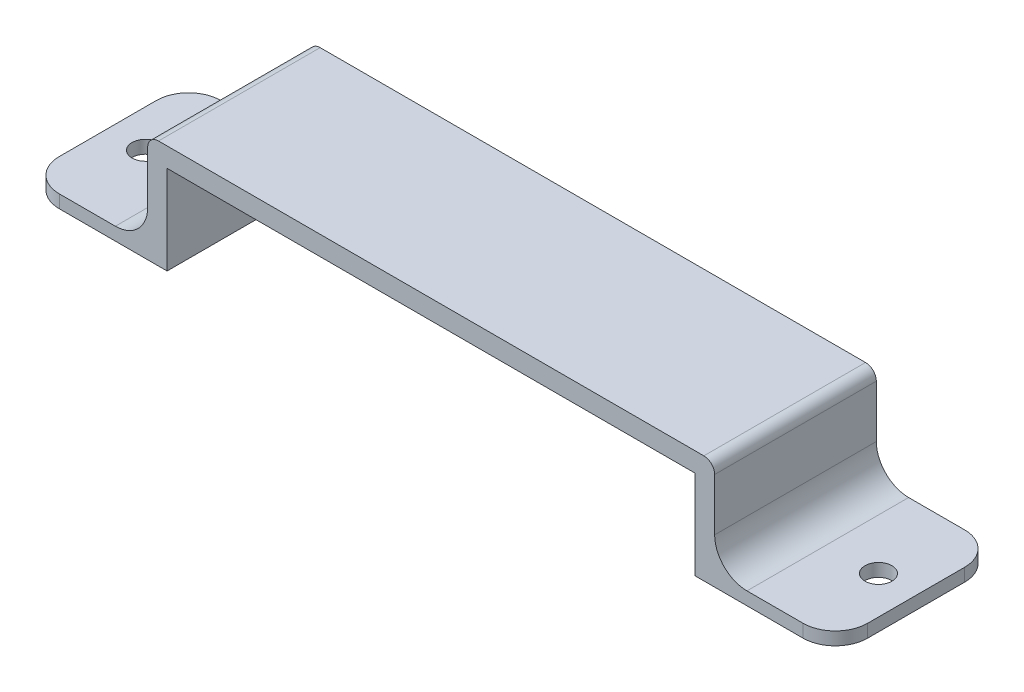
ISO-10303-21;
HEADER;
FILE_DESCRIPTION(('STEP AP214'),'2;1');
FILE_NAME('part.step','',(''),(''),'','','');
FILE_SCHEMA(('AUTOMOTIVE_DESIGN { 1 0 10303 214 1 1 1 1 }'));
ENDSEC;
DATA;
#1=APPLICATION_CONTEXT('core data for automotive mechanical design processes');
#2=APPLICATION_PROTOCOL_DEFINITION('international standard','automotive_design',2000,#1);
#3=PRODUCT_CONTEXT('',#1,'mechanical');
#4=PRODUCT('Part','Part','',(#3));
#5=PRODUCT_RELATED_PRODUCT_CATEGORY('part','',(#4));
#6=PRODUCT_DEFINITION_FORMATION('','',#4);
#7=PRODUCT_DEFINITION_CONTEXT('part definition',#1,'design');
#8=PRODUCT_DEFINITION('design','',#6,#7);
#9=PRODUCT_DEFINITION_SHAPE('','',#8);
#10=(LENGTH_UNIT() NAMED_UNIT(*) SI_UNIT(.MILLI.,.METRE.));
#11=(NAMED_UNIT(*) PLANE_ANGLE_UNIT() SI_UNIT($,.RADIAN.));
#12=(NAMED_UNIT(*) SI_UNIT($,.STERADIAN.) SOLID_ANGLE_UNIT());
#13=UNCERTAINTY_MEASURE_WITH_UNIT(LENGTH_MEASURE(1.E-05),#10,'distance_accuracy_value','');
#14=(GEOMETRIC_REPRESENTATION_CONTEXT(3) GLOBAL_UNCERTAINTY_ASSIGNED_CONTEXT((#13)) GLOBAL_UNIT_ASSIGNED_CONTEXT((#10,
#11,#12)) REPRESENTATION_CONTEXT('',''));
#15=CARTESIAN_POINT('',(0.,0.,0.));
#16=DIRECTION('',(0.,0.,1.));
#17=DIRECTION('',(1.,0.,0.));
#18=AXIS2_PLACEMENT_3D('',#15,#16,#17);
#19=CARTESIAN_POINT('',(-21.8742298573392,1.2,15.));
#20=DIRECTION('',(1.,0.,0.));
#21=DIRECTION('',(0.,1.,0.));
#22=AXIS2_PLACEMENT_3D('',#19,#20,#21);
#23=PLANE('',#22);
#24=DIRECTION('',(0.,0.,-1.));
#25=VECTOR('',#24,1.);
#26=CARTESIAN_POINT('',(-21.8742298573392,0.,15.));
#27=LINE('',#26,#25);
#28=CARTESIAN_POINT('',(-21.8742298573392,0.,12.));
#29=VERTEX_POINT('',#28);
#30=CARTESIAN_POINT('',(-21.8742298573392,0.,3.));
#31=VERTEX_POINT('',#30);
#32=EDGE_CURVE('E200',#29,#31,#27,.T.);
#33=ORIENTED_EDGE('',*,*,#32,.F.);
#34=DIRECTION('',(0.,-1.,0.));
#35=VECTOR('',#34,1.);
#36=CARTESIAN_POINT('',(-21.8742298573392,1.2,12.));
#37=LINE('',#36,#35);
#38=CARTESIAN_POINT('',(-21.8742298573392,1.2,12.));
#39=VERTEX_POINT('',#38);
#40=EDGE_CURVE('E355',#29,#39,#37,.F.);
#41=ORIENTED_EDGE('',*,*,#40,.T.);
#42=DIRECTION('',(0.,0.,-1.));
#43=VECTOR('',#42,1.);
#44=CARTESIAN_POINT('',(-21.8742298573392,1.2,15.));
#45=LINE('',#44,#43);
#46=CARTESIAN_POINT('',(-21.8742298573392,1.2,3.));
#47=VERTEX_POINT('',#46);
#48=EDGE_CURVE('E236',#39,#47,#45,.T.);
#49=ORIENTED_EDGE('',*,*,#48,.T.);
#50=DIRECTION('',(0.,-1.,0.));
#51=VECTOR('',#50,1.);
#52=CARTESIAN_POINT('',(-21.8742298573392,1.2,3.));
#53=LINE('',#52,#51);
#54=EDGE_CURVE('E351',#47,#31,#53,.T.);
#55=ORIENTED_EDGE('',*,*,#54,.T.);
#56=EDGE_LOOP('',(#33,#41,#49,#55));
#57=FACE_BOUND('',#56,.T.);
#58=ADVANCED_FACE('F39',(#57),#23,.F.);
#59=CARTESIAN_POINT('',(-21.8742298573392,0.,15.));
#60=DIRECTION('',(0.,1.,0.));
#61=DIRECTION('',(-1.,0.,0.));
#62=AXIS2_PLACEMENT_3D('',#59,#60,#61);
#63=PLANE('',#62);
#64=CARTESIAN_POINT('',(-18.3742298573392,0.,7.5));
#65=DIRECTION('',(0.,1.,0.));
#66=DIRECTION('',(-1.,0.,0.));
#67=AXIS2_PLACEMENT_3D('',#64,#65,#66);
#68=CIRCLE('',#67,1.25);
#69=CARTESIAN_POINT('',(-19.6242298573392,0.,7.5));
#70=VERTEX_POINT('',#69);
#71=EDGE_CURVE('E240',#70,#70,#68,.F.);
#72=ORIENTED_EDGE('',*,*,#71,.F.);
#73=EDGE_LOOP('',(#72));
#74=FACE_BOUND('',#73,.T.);
#75=DIRECTION('',(1.,0.,0.));
#76=VECTOR('',#75,1.);
#77=CARTESIAN_POINT('',(-21.8742298573392,0.,15.));
#78=LINE('',#77,#76);
#79=CARTESIAN_POINT('',(-18.8742298573392,0.,15.));
#80=VERTEX_POINT('',#79);
#81=CARTESIAN_POINT('',(-8.87422985733918,0.,15.));
#82=VERTEX_POINT('',#81);
#83=EDGE_CURVE('E179',#80,#82,#78,.T.);
#84=ORIENTED_EDGE('',*,*,#83,.F.);
#85=CARTESIAN_POINT('',(-18.8742298573392,0.,12.));
#86=DIRECTION('',(0.,1.,0.));
#87=DIRECTION('',(-1.,0.,0.));
#88=AXIS2_PLACEMENT_3D('',#85,#86,#87);
#89=CIRCLE('',#88,3.);
#90=EDGE_CURVE('E348',#80,#29,#89,.F.);
#91=ORIENTED_EDGE('',*,*,#90,.T.);
#92=ORIENTED_EDGE('',*,*,#32,.T.);
#93=CARTESIAN_POINT('',(-18.8742298573392,0.,3.));
#94=DIRECTION('',(0.,1.,0.));
#95=DIRECTION('',(-1.,0.,0.));
#96=AXIS2_PLACEMENT_3D('',#93,#94,#95);
#97=CIRCLE('',#96,3.);
#98=CARTESIAN_POINT('',(-18.8742298573392,0.,0.));
#99=VERTEX_POINT('',#98);
#100=EDGE_CURVE('E345',#31,#99,#97,.F.);
#101=ORIENTED_EDGE('',*,*,#100,.T.);
#102=DIRECTION('',(1.,0.,0.));
#103=VECTOR('',#102,1.);
#104=CARTESIAN_POINT('',(-21.8742298573392,0.,0.));
#105=LINE('',#104,#103);
#106=CARTESIAN_POINT('',(-8.87422985733918,0.,0.));
#107=VERTEX_POINT('',#106);
#108=EDGE_CURVE('E196',#99,#107,#105,.T.);
#109=ORIENTED_EDGE('',*,*,#108,.T.);
#110=DIRECTION('',(0.,0.,-1.));
#111=VECTOR('',#110,1.);
#112=CARTESIAN_POINT('',(-8.87422985733918,0.,15.));
#113=LINE('',#112,#111);
#114=EDGE_CURVE('E193',#82,#107,#113,.T.);
#115=ORIENTED_EDGE('',*,*,#114,.F.);
#116=EDGE_LOOP('',(#84,#91,#92,#101,#109,#115));
#117=FACE_BOUND('',#116,.T.);
#118=ADVANCED_FACE('F194',(#74,#117),#63,.F.);
#119=CARTESIAN_POINT('',(-8.87422985733918,0.,15.));
#120=DIRECTION('',(-1.,0.,0.));
#121=DIRECTION('',(0.,-1.,0.));
#122=AXIS2_PLACEMENT_3D('',#119,#120,#121);
#123=PLANE('',#122);
#124=DIRECTION('',(0.,1.,0.));
#125=VECTOR('',#124,1.);
#126=CARTESIAN_POINT('',(-8.87422985733918,0.,0.));
#127=LINE('',#126,#125);
#128=CARTESIAN_POINT('',(-8.87422985733918,8.25,0.));
#129=VERTEX_POINT('',#128);
#130=EDGE_CURVE('E239',#107,#129,#127,.T.);
#131=ORIENTED_EDGE('',*,*,#130,.T.);
#132=DIRECTION('',(0.,0.,-1.));
#133=VECTOR('',#132,1.);
#134=CARTESIAN_POINT('',(-8.87422985733918,8.25,15.));
#135=LINE('',#134,#133);
#136=CARTESIAN_POINT('',(-8.87422985733918,8.25,15.));
#137=VERTEX_POINT('',#136);
#138=EDGE_CURVE('E201',#137,#129,#135,.T.);
#139=ORIENTED_EDGE('',*,*,#138,.F.);
#140=DIRECTION('',(0.,1.,0.));
#141=VECTOR('',#140,1.);
#142=CARTESIAN_POINT('',(-8.87422985733918,0.,15.));
#143=LINE('',#142,#141);
#144=EDGE_CURVE('E183',#82,#137,#143,.T.);
#145=ORIENTED_EDGE('',*,*,#144,.F.);
#146=ORIENTED_EDGE('',*,*,#114,.T.);
#147=EDGE_LOOP('',(#131,#139,#145,#146));
#148=FACE_BOUND('',#147,.T.);
#149=ADVANCED_FACE('F203',(#148),#123,.F.);
#150=CARTESIAN_POINT('',(-8.87422985733918,8.25,15.));
#151=DIRECTION('',(0.,1.,0.));
#152=DIRECTION('',(0.,0.,1.));
#153=AXIS2_PLACEMENT_3D('',#150,#151,#152);
#154=PLANE('',#153);
#155=DIRECTION('',(1.,0.,0.));
#156=VECTOR('',#155,1.);
#157=CARTESIAN_POINT('',(-8.87422985733918,8.25,0.));
#158=LINE('',#157,#156);
#159=CARTESIAN_POINT('',(40.1257701426608,8.25,0.));
#160=VERTEX_POINT('',#159);
#161=EDGE_CURVE('E243',#129,#160,#158,.T.);
#162=ORIENTED_EDGE('',*,*,#161,.T.);
#163=DIRECTION('',(0.,0.,-1.));
#164=VECTOR('',#163,1.);
#165=CARTESIAN_POINT('',(40.1257701426608,8.25,15.));
#166=LINE('',#165,#164);
#167=CARTESIAN_POINT('',(40.1257701426608,8.25,15.));
#168=VERTEX_POINT('',#167);
#169=EDGE_CURVE('E284',#168,#160,#166,.T.);
#170=ORIENTED_EDGE('',*,*,#169,.F.);
#171=DIRECTION('',(1.,0.,0.));
#172=VECTOR('',#171,1.);
#173=CARTESIAN_POINT('',(-8.87422985733918,8.25,15.));
#174=LINE('',#173,#172);
#175=EDGE_CURVE('E207',#137,#168,#174,.T.);
#176=ORIENTED_EDGE('',*,*,#175,.F.);
#177=ORIENTED_EDGE('',*,*,#138,.T.);
#178=EDGE_LOOP('',(#162,#170,#176,#177));
#179=FACE_BOUND('',#178,.T.);
#180=ADVANCED_FACE('F444',(#179),#154,.F.);
#181=CARTESIAN_POINT('',(40.1257701426608,8.25,15.));
#182=DIRECTION('',(1.,0.,0.));
#183=DIRECTION('',(0.,1.,0.));
#184=AXIS2_PLACEMENT_3D('',#181,#182,#183);
#185=PLANE('',#184);
#186=DIRECTION('',(0.,-1.,0.));
#187=VECTOR('',#186,1.);
#188=CARTESIAN_POINT('',(40.1257701426608,8.25,0.));
#189=LINE('',#188,#187);
#190=CARTESIAN_POINT('',(40.1257701426608,0.,0.));
#191=VERTEX_POINT('',#190);
#192=EDGE_CURVE('E246',#160,#191,#189,.T.);
#193=ORIENTED_EDGE('',*,*,#192,.T.);
#194=DIRECTION('',(0.,0.,-1.));
#195=VECTOR('',#194,1.);
#196=CARTESIAN_POINT('',(40.1257701426608,0.,15.));
#197=LINE('',#196,#195);
#198=CARTESIAN_POINT('',(40.1257701426608,0.,15.));
#199=VERTEX_POINT('',#198);
#200=EDGE_CURVE('E280',#199,#191,#197,.T.);
#201=ORIENTED_EDGE('',*,*,#200,.F.);
#202=DIRECTION('',(0.,-1.,0.));
#203=VECTOR('',#202,1.);
#204=CARTESIAN_POINT('',(40.1257701426608,8.25,15.));
#205=LINE('',#204,#203);
#206=EDGE_CURVE('E210',#168,#199,#205,.T.);
#207=ORIENTED_EDGE('',*,*,#206,.F.);
#208=ORIENTED_EDGE('',*,*,#169,.T.);
#209=EDGE_LOOP('',(#193,#201,#207,#208));
#210=FACE_BOUND('',#209,.T.);
#211=ADVANCED_FACE('F441',(#210),#185,.F.);
#212=CARTESIAN_POINT('',(40.1257701426608,0.,15.));
#213=DIRECTION('',(0.,1.,0.));
#214=DIRECTION('',(0.,0.,1.));
#215=AXIS2_PLACEMENT_3D('',#212,#213,#214);
#216=PLANE('',#215);
#217=CARTESIAN_POINT('',(49.6257701426608,0.,7.5));
#218=DIRECTION('',(0.,1.,0.));
#219=DIRECTION('',(0.,0.,1.));
#220=AXIS2_PLACEMENT_3D('',#217,#218,#219);
#221=CIRCLE('',#220,1.25);
#222=CARTESIAN_POINT('',(49.6257701426608,0.,8.75));
#223=VERTEX_POINT('',#222);
#224=EDGE_CURVE('E638',#223,#223,#221,.F.);
#225=ORIENTED_EDGE('',*,*,#224,.F.);
#226=EDGE_LOOP('',(#225));
#227=FACE_BOUND('',#226,.T.);
#228=DIRECTION('',(1.,0.,0.));
#229=VECTOR('',#228,1.);
#230=CARTESIAN_POINT('',(40.1257701426608,0.,0.));
#231=LINE('',#230,#229);
#232=CARTESIAN_POINT('',(50.1257701426608,0.,0.));
#233=VERTEX_POINT('',#232);
#234=EDGE_CURVE('E249',#191,#233,#231,.T.);
#235=ORIENTED_EDGE('',*,*,#234,.T.);
#236=CARTESIAN_POINT('',(50.1257701426608,0.,3.));
#237=DIRECTION('',(0.,1.,0.));
#238=DIRECTION('',(0.,0.,1.));
#239=AXIS2_PLACEMENT_3D('',#236,#237,#238);
#240=CIRCLE('',#239,3.);
#241=CARTESIAN_POINT('',(53.1257701426608,0.,3.));
#242=VERTEX_POINT('',#241);
#243=EDGE_CURVE('E318',#233,#242,#240,.F.);
#244=ORIENTED_EDGE('',*,*,#243,.T.);
#245=DIRECTION('',(0.,0.,-1.));
#246=VECTOR('',#245,1.);
#247=CARTESIAN_POINT('',(53.1257701426608,0.,15.));
#248=LINE('',#247,#246);
#249=CARTESIAN_POINT('',(53.1257701426608,0.,12.));
#250=VERTEX_POINT('',#249);
#251=EDGE_CURVE('E276',#250,#242,#248,.T.);
#252=ORIENTED_EDGE('',*,*,#251,.F.);
#253=CARTESIAN_POINT('',(50.1257701426608,0.,12.));
#254=DIRECTION('',(0.,1.,0.));
#255=DIRECTION('',(0.,0.,1.));
#256=AXIS2_PLACEMENT_3D('',#253,#254,#255);
#257=CIRCLE('',#256,3.);
#258=CARTESIAN_POINT('',(50.1257701426608,0.,15.));
#259=VERTEX_POINT('',#258);
#260=EDGE_CURVE('E315',#250,#259,#257,.F.);
#261=ORIENTED_EDGE('',*,*,#260,.T.);
#262=DIRECTION('',(1.,0.,0.));
#263=VECTOR('',#262,1.);
#264=CARTESIAN_POINT('',(40.1257701426608,0.,15.));
#265=LINE('',#264,#263);
#266=EDGE_CURVE('E216',#199,#259,#265,.T.);
#267=ORIENTED_EDGE('',*,*,#266,.F.);
#268=ORIENTED_EDGE('',*,*,#200,.T.);
#269=EDGE_LOOP('',(#235,#244,#252,#261,#267,#268));
#270=FACE_BOUND('',#269,.T.);
#271=ADVANCED_FACE('F430',(#227,#270),#216,.F.);
#272=CARTESIAN_POINT('',(53.1257701426608,0.,15.));
#273=DIRECTION('',(-1.,0.,0.));
#274=DIRECTION('',(0.,0.,1.));
#275=AXIS2_PLACEMENT_3D('',#272,#273,#274);
#276=PLANE('',#275);
#277=ORIENTED_EDGE('',*,*,#251,.T.);
#278=DIRECTION('',(0.,1.,0.));
#279=VECTOR('',#278,1.);
#280=CARTESIAN_POINT('',(53.1257701426608,0.,3.));
#281=LINE('',#280,#279);
#282=CARTESIAN_POINT('',(53.1257701426608,1.20000000000001,3.));
#283=VERTEX_POINT('',#282);
#284=EDGE_CURVE('E296',#242,#283,#281,.T.);
#285=ORIENTED_EDGE('',*,*,#284,.T.);
#286=DIRECTION('',(0.,0.,-1.));
#287=VECTOR('',#286,1.);
#288=CARTESIAN_POINT('',(53.1257701426608,1.20000000000001,15.));
#289=LINE('',#288,#287);
#290=CARTESIAN_POINT('',(53.1257701426608,1.20000000000001,12.));
#291=VERTEX_POINT('',#290);
#292=EDGE_CURVE('E272',#291,#283,#289,.T.);
#293=ORIENTED_EDGE('',*,*,#292,.F.);
#294=DIRECTION('',(0.,1.,0.));
#295=VECTOR('',#294,1.);
#296=CARTESIAN_POINT('',(53.1257701426608,0.,12.));
#297=LINE('',#296,#295);
#298=EDGE_CURVE('E293',#291,#250,#297,.F.);
#299=ORIENTED_EDGE('',*,*,#298,.T.);
#300=EDGE_LOOP('',(#277,#285,#293,#299));
#301=FACE_BOUND('',#300,.T.);
#302=ADVANCED_FACE('F425',(#301),#276,.F.);
#303=CARTESIAN_POINT('',(53.1257701426608,1.20000000000001,15.));
#304=DIRECTION('',(0.,-1.,0.));
#305=DIRECTION('',(1.,0.,0.));
#306=AXIS2_PLACEMENT_3D('',#303,#304,#305);
#307=PLANE('',#306);
#308=CARTESIAN_POINT('',(49.6257701426608,1.2,7.5));
#309=DIRECTION('',(0.,1.,0.));
#310=DIRECTION('',(-1.,0.,0.));
#311=AXIS2_PLACEMENT_3D('',#308,#309,#310);
#312=CIRCLE('',#311,1.25);
#313=CARTESIAN_POINT('',(48.3757701426608,1.2,7.5));
#314=VERTEX_POINT('',#313);
#315=EDGE_CURVE('E635',#314,#314,#312,.T.);
#316=ORIENTED_EDGE('',*,*,#315,.F.);
#317=EDGE_LOOP('',(#316));
#318=FACE_BOUND('',#317,.T.);
#319=ORIENTED_EDGE('',*,*,#292,.T.);
#320=CARTESIAN_POINT('',(50.1257701426608,1.20000000000001,3.));
#321=DIRECTION('',(0.,-1.,0.));
#322=DIRECTION('',(1.,0.,0.));
#323=AXIS2_PLACEMENT_3D('',#320,#321,#322);
#324=CIRCLE('',#323,3.);
#325=CARTESIAN_POINT('',(50.1257701426608,1.20000000000001,0.));
#326=VERTEX_POINT('',#325);
#327=EDGE_CURVE('E306',#283,#326,#324,.F.);
#328=ORIENTED_EDGE('',*,*,#327,.T.);
#329=DIRECTION('',(-1.,0.,0.));
#330=VECTOR('',#329,1.);
#331=CARTESIAN_POINT('',(53.1257701426608,1.20000000000001,0.));
#332=LINE('',#331,#330);
#333=CARTESIAN_POINT('',(44.9257701426608,1.20000000000001,0.));
#334=VERTEX_POINT('',#333);
#335=EDGE_CURVE('E253',#326,#334,#332,.T.);
#336=ORIENTED_EDGE('',*,*,#335,.T.);
#337=DIRECTION('',(0.,0.,-1.));
#338=VECTOR('',#337,1.);
#339=CARTESIAN_POINT('',(44.9257701426608,1.20000000000001,15.));
#340=LINE('',#339,#338);
#341=CARTESIAN_POINT('',(44.9257701426608,1.20000000000001,15.));
#342=VERTEX_POINT('',#341);
#343=EDGE_CURVE('E300',#334,#342,#340,.F.);
#344=ORIENTED_EDGE('',*,*,#343,.T.);
#345=DIRECTION('',(-1.,0.,0.));
#346=VECTOR('',#345,1.);
#347=CARTESIAN_POINT('',(53.1257701426608,1.20000000000001,15.));
#348=LINE('',#347,#346);
#349=CARTESIAN_POINT('',(50.1257701426608,1.20000000000001,15.));
#350=VERTEX_POINT('',#349);
#351=EDGE_CURVE('E220',#350,#342,#348,.T.);
#352=ORIENTED_EDGE('',*,*,#351,.F.);
#353=CARTESIAN_POINT('',(50.1257701426608,1.20000000000001,12.));
#354=DIRECTION('',(0.,-1.,0.));
#355=DIRECTION('',(1.,0.,0.));
#356=AXIS2_PLACEMENT_3D('',#353,#354,#355);
#357=CIRCLE('',#356,3.);
#358=EDGE_CURVE('E303',#350,#291,#357,.F.);
#359=ORIENTED_EDGE('',*,*,#358,.T.);
#360=EDGE_LOOP('',(#319,#328,#336,#344,#352,#359));
#361=FACE_BOUND('',#360,.T.);
#362=ADVANCED_FACE('F417',(#318,#361),#307,.F.);
#363=CARTESIAN_POINT('',(41.9257701426608,1.20000000000001,15.));
#364=DIRECTION('',(-1.,0.,0.));
#365=DIRECTION('',(0.,-1.,0.));
#366=AXIS2_PLACEMENT_3D('',#363,#364,#365);
#367=PLANE('',#366);
#368=DIRECTION('',(0.,1.,0.));
#369=VECTOR('',#368,1.);
#370=CARTESIAN_POINT('',(41.9257701426608,1.20000000000001,0.));
#371=LINE('',#370,#369);
#372=CARTESIAN_POINT('',(41.9257701426608,4.20000000000001,0.));
#373=VERTEX_POINT('',#372);
#374=CARTESIAN_POINT('',(41.9257701426608,9.05,0.));
#375=VERTEX_POINT('',#374);
#376=EDGE_CURVE('E257',#373,#375,#371,.T.);
#377=ORIENTED_EDGE('',*,*,#376,.T.);
#378=DIRECTION('',(0.,0.,-1.));
#379=VECTOR('',#378,1.);
#380=CARTESIAN_POINT('',(41.9257701426608,9.05,15.));
#381=LINE('',#380,#379);
#382=CARTESIAN_POINT('',(41.9257701426608,9.05,15.));
#383=VERTEX_POINT('',#382);
#384=EDGE_CURVE('E11',#375,#383,#381,.F.);
#385=ORIENTED_EDGE('',*,*,#384,.T.);
#386=DIRECTION('',(0.,1.,0.));
#387=VECTOR('',#386,1.);
#388=CARTESIAN_POINT('',(41.9257701426608,1.20000000000001,15.));
#389=LINE('',#388,#387);
#390=CARTESIAN_POINT('',(41.9257701426608,4.20000000000001,15.));
#391=VERTEX_POINT('',#390);
#392=EDGE_CURVE('E224',#391,#383,#389,.T.);
#393=ORIENTED_EDGE('',*,*,#392,.F.);
#394=DIRECTION('',(0.,0.,-1.));
#395=VECTOR('',#394,1.);
#396=CARTESIAN_POINT('',(41.9257701426608,4.20000000000001,0.));
#397=LINE('',#396,#395);
#398=EDGE_CURVE('E327',#391,#373,#397,.T.);
#399=ORIENTED_EDGE('',*,*,#398,.T.);
#400=EDGE_LOOP('',(#377,#385,#393,#399));
#401=FACE_BOUND('',#400,.T.);
#402=ADVANCED_FACE('F408',(#401),#367,.F.);
#403=CARTESIAN_POINT('',(41.9257701426608,10.05,15.));
#404=DIRECTION('',(0.,-1.,0.));
#405=DIRECTION('',(1.,0.,0.));
#406=AXIS2_PLACEMENT_3D('',#403,#404,#405);
#407=PLANE('',#406);
#408=DIRECTION('',(-1.,0.,0.));
#409=VECTOR('',#408,1.);
#410=CARTESIAN_POINT('',(41.9257701426608,10.05,0.));
#411=LINE('',#410,#409);
#412=CARTESIAN_POINT('',(40.9257701426608,10.05,0.));
#413=VERTEX_POINT('',#412);
#414=CARTESIAN_POINT('',(-9.67422985733918,10.05,0.));
#415=VERTEX_POINT('',#414);
#416=EDGE_CURVE('E260',#413,#415,#411,.T.);
#417=ORIENTED_EDGE('',*,*,#416,.T.);
#418=DIRECTION('',(0.,0.,-1.));
#419=VECTOR('',#418,1.);
#420=CARTESIAN_POINT('',(-9.67422985733918,10.05,15.));
#421=LINE('',#420,#419);
#422=CARTESIAN_POINT('',(-9.67422985733918,10.05,15.));
#423=VERTEX_POINT('',#422);
#424=EDGE_CURVE('E61',#415,#423,#421,.F.);
#425=ORIENTED_EDGE('',*,*,#424,.T.);
#426=DIRECTION('',(-1.,0.,0.));
#427=VECTOR('',#426,1.);
#428=CARTESIAN_POINT('',(41.9257701426608,10.05,15.));
#429=LINE('',#428,#427);
#430=CARTESIAN_POINT('',(40.9257701426608,10.05,15.));
#431=VERTEX_POINT('',#430);
#432=EDGE_CURVE('E227',#431,#423,#429,.T.);
#433=ORIENTED_EDGE('',*,*,#432,.F.);
#434=DIRECTION('',(0.,0.,-1.));
#435=VECTOR('',#434,1.);
#436=CARTESIAN_POINT('',(40.9257701426608,10.05,15.));
#437=LINE('',#436,#435);
#438=EDGE_CURVE('E381',#431,#413,#437,.T.);
#439=ORIENTED_EDGE('',*,*,#438,.T.);
#440=EDGE_LOOP('',(#417,#425,#433,#439));
#441=FACE_BOUND('',#440,.T.);
#442=ADVANCED_FACE('F403',(#441),#407,.F.);
#443=CARTESIAN_POINT('',(-10.6742298573392,10.05,15.));
#444=DIRECTION('',(1.,0.,0.));
#445=DIRECTION('',(0.,1.,0.));
#446=AXIS2_PLACEMENT_3D('',#443,#444,#445);
#447=PLANE('',#446);
#448=DIRECTION('',(0.,-1.,0.));
#449=VECTOR('',#448,1.);
#450=CARTESIAN_POINT('',(-10.6742298573392,10.05,15.));
#451=LINE('',#450,#449);
#452=CARTESIAN_POINT('',(-10.6742298573392,9.04999999999999,15.));
#453=VERTEX_POINT('',#452);
#454=CARTESIAN_POINT('',(-10.6742298573392,4.2,15.));
#455=VERTEX_POINT('',#454);
#456=EDGE_CURVE('E230',#453,#455,#451,.T.);
#457=ORIENTED_EDGE('',*,*,#456,.F.);
#458=DIRECTION('',(0.,0.,-1.));
#459=VECTOR('',#458,1.);
#460=CARTESIAN_POINT('',(-10.6742298573392,9.04999999999999,15.));
#461=LINE('',#460,#459);
#462=CARTESIAN_POINT('',(-10.6742298573392,9.04999999999999,0.));
#463=VERTEX_POINT('',#462);
#464=EDGE_CURVE('E371',#453,#463,#461,.T.);
#465=ORIENTED_EDGE('',*,*,#464,.T.);
#466=DIRECTION('',(0.,-1.,0.));
#467=VECTOR('',#466,1.);
#468=CARTESIAN_POINT('',(-10.6742298573392,10.05,0.));
#469=LINE('',#468,#467);
#470=CARTESIAN_POINT('',(-10.6742298573392,4.2,0.));
#471=VERTEX_POINT('',#470);
#472=EDGE_CURVE('E263',#463,#471,#469,.T.);
#473=ORIENTED_EDGE('',*,*,#472,.T.);
#474=DIRECTION('',(0.,0.,-1.));
#475=VECTOR('',#474,1.);
#476=CARTESIAN_POINT('',(-10.6742298573392,4.2,15.));
#477=LINE('',#476,#475);
#478=EDGE_CURVE('E341',#471,#455,#477,.F.);
#479=ORIENTED_EDGE('',*,*,#478,.T.);
#480=EDGE_LOOP('',(#457,#465,#473,#479));
#481=FACE_BOUND('',#480,.T.);
#482=ADVANCED_FACE('F395',(#481),#447,.F.);
#483=CARTESIAN_POINT('',(-10.6742298573392,1.2,15.));
#484=DIRECTION('',(0.,-1.,0.));
#485=DIRECTION('',(1.,0.,0.));
#486=AXIS2_PLACEMENT_3D('',#483,#484,#485);
#487=PLANE('',#486);
#488=CARTESIAN_POINT('',(-18.3742298573392,1.2,7.5));
#489=DIRECTION('',(0.,1.,0.));
#490=DIRECTION('',(-1.,0.,0.));
#491=AXIS2_PLACEMENT_3D('',#488,#489,#490);
#492=CIRCLE('',#491,1.25);
#493=CARTESIAN_POINT('',(-19.6242298573392,1.2,7.5));
#494=VERTEX_POINT('',#493);
#495=EDGE_CURVE('E640',#494,#494,#492,.T.);
#496=ORIENTED_EDGE('',*,*,#495,.F.);
#497=EDGE_LOOP('',(#496));
#498=FACE_BOUND('',#497,.T.);
#499=DIRECTION('',(-1.,0.,0.));
#500=VECTOR('',#499,1.);
#501=CARTESIAN_POINT('',(-10.6742298573392,1.2,15.));
#502=LINE('',#501,#500);
#503=CARTESIAN_POINT('',(-13.6742298573392,1.2,15.));
#504=VERTEX_POINT('',#503);
#505=CARTESIAN_POINT('',(-18.8742298573392,1.2,15.));
#506=VERTEX_POINT('',#505);
#507=EDGE_CURVE('E233',#504,#506,#502,.T.);
#508=ORIENTED_EDGE('',*,*,#507,.F.);
#509=DIRECTION('',(0.,0.,-1.));
#510=VECTOR('',#509,1.);
#511=CARTESIAN_POINT('',(-13.6742298573392,1.2,0.));
#512=LINE('',#511,#510);
#513=CARTESIAN_POINT('',(-13.6742298573392,1.2,0.));
#514=VERTEX_POINT('',#513);
#515=EDGE_CURVE('E337',#504,#514,#512,.T.);
#516=ORIENTED_EDGE('',*,*,#515,.T.);
#517=DIRECTION('',(-1.,0.,0.));
#518=VECTOR('',#517,1.);
#519=CARTESIAN_POINT('',(-10.6742298573392,1.2,0.));
#520=LINE('',#519,#518);
#521=CARTESIAN_POINT('',(-18.8742298573392,1.2,0.));
#522=VERTEX_POINT('',#521);
#523=EDGE_CURVE('E190',#514,#522,#520,.T.);
#524=ORIENTED_EDGE('',*,*,#523,.T.);
#525=CARTESIAN_POINT('',(-18.8742298573392,1.2,3.));
#526=DIRECTION('',(0.,-1.,0.));
#527=DIRECTION('',(1.,0.,0.));
#528=AXIS2_PLACEMENT_3D('',#525,#526,#527);
#529=CIRCLE('',#528,3.);
#530=EDGE_CURVE('E331',#522,#47,#529,.F.);
#531=ORIENTED_EDGE('',*,*,#530,.T.);
#532=ORIENTED_EDGE('',*,*,#48,.F.);
#533=CARTESIAN_POINT('',(-18.8742298573392,1.2,12.));
#534=DIRECTION('',(0.,-1.,0.));
#535=DIRECTION('',(1.,0.,0.));
#536=AXIS2_PLACEMENT_3D('',#533,#534,#535);
#537=CIRCLE('',#536,3.);
#538=EDGE_CURVE('E334',#39,#506,#537,.F.);
#539=ORIENTED_EDGE('',*,*,#538,.T.);
#540=EDGE_LOOP('',(#508,#516,#524,#531,#532,#539));
#541=FACE_BOUND('',#540,.T.);
#542=ADVANCED_FACE('F509',(#498,#541),#487,.F.);
#543=CARTESIAN_POINT('',(0.,0.,15.));
#544=DIRECTION('',(0.,0.,1.));
#545=DIRECTION('',(1.,0.,0.));
#546=AXIS2_PLACEMENT_3D('',#543,#544,#545);
#547=PLANE('',#546);
#548=ORIENTED_EDGE('',*,*,#432,.T.);
#549=CARTESIAN_POINT('',(-9.67422985733918,9.04999999999999,15.));
#550=DIRECTION('',(0.,0.,1.));
#551=DIRECTION('',(1.,0.,0.));
#552=AXIS2_PLACEMENT_3D('',#549,#550,#551);
#553=CIRCLE('',#552,1.);
#554=EDGE_CURVE('E48',#423,#453,#553,.T.);
#555=ORIENTED_EDGE('',*,*,#554,.T.);
#556=ORIENTED_EDGE('',*,*,#456,.T.);
#557=CARTESIAN_POINT('',(-13.6742298573392,4.2,15.));
#558=DIRECTION('',(0.,0.,1.));
#559=DIRECTION('',(1.,0.,0.));
#560=AXIS2_PLACEMENT_3D('',#557,#558,#559);
#561=CIRCLE('',#560,3.);
#562=EDGE_CURVE('E368',#455,#504,#561,.F.);
#563=ORIENTED_EDGE('',*,*,#562,.T.);
#564=ORIENTED_EDGE('',*,*,#507,.T.);
#565=DIRECTION('',(0.,-1.,0.));
#566=VECTOR('',#565,1.);
#567=CARTESIAN_POINT('',(-18.8742298573392,0.,15.));
#568=LINE('',#567,#566);
#569=EDGE_CURVE('E187',#506,#80,#568,.T.);
#570=ORIENTED_EDGE('',*,*,#569,.T.);
#571=ORIENTED_EDGE('',*,*,#83,.T.);
#572=ORIENTED_EDGE('',*,*,#144,.T.);
#573=ORIENTED_EDGE('',*,*,#175,.T.);
#574=ORIENTED_EDGE('',*,*,#206,.T.);
#575=ORIENTED_EDGE('',*,*,#266,.T.);
#576=DIRECTION('',(0.,1.,0.));
#577=VECTOR('',#576,1.);
#578=CARTESIAN_POINT('',(50.1257701426608,1.20000000000001,15.));
#579=LINE('',#578,#577);
#580=EDGE_CURVE('E323',#259,#350,#579,.T.);
#581=ORIENTED_EDGE('',*,*,#580,.T.);
#582=ORIENTED_EDGE('',*,*,#351,.T.);
#583=CARTESIAN_POINT('',(44.9257701426608,4.20000000000001,15.));
#584=DIRECTION('',(0.,0.,1.));
#585=DIRECTION('',(1.,0.,0.));
#586=AXIS2_PLACEMENT_3D('',#583,#584,#585);
#587=CIRCLE('',#586,3.);
#588=EDGE_CURVE('E361',#342,#391,#587,.F.);
#589=ORIENTED_EDGE('',*,*,#588,.T.);
#590=ORIENTED_EDGE('',*,*,#392,.T.);
#591=CARTESIAN_POINT('',(40.9257701426608,9.05,15.));
#592=DIRECTION('',(0.,0.,1.));
#593=DIRECTION('',(1.,0.,0.));
#594=AXIS2_PLACEMENT_3D('',#591,#592,#593);
#595=CIRCLE('',#594,1.);
#596=EDGE_CURVE('E387',#383,#431,#595,.T.);
#597=ORIENTED_EDGE('',*,*,#596,.T.);
#598=EDGE_LOOP('',(#548,#555,#556,#563,#564,#570,#571,#572,#573,#574,#575,#581,#582,#589,#590,#597));
#599=FACE_BOUND('',#598,.T.);
#600=ADVANCED_FACE('F181',(#599),#547,.T.);
#601=CARTESIAN_POINT('',(0.,0.,0.));
#602=DIRECTION('',(0.,0.,1.));
#603=DIRECTION('',(1.,0.,0.));
#604=AXIS2_PLACEMENT_3D('',#601,#602,#603);
#605=PLANE('',#604);
#606=ORIENTED_EDGE('',*,*,#472,.F.);
#607=CARTESIAN_POINT('',(-9.67422985733918,9.04999999999999,0.));
#608=DIRECTION('',(0.,0.,1.));
#609=DIRECTION('',(1.,0.,0.));
#610=AXIS2_PLACEMENT_3D('',#607,#608,#609);
#611=CIRCLE('',#610,1.);
#612=EDGE_CURVE('E378',#463,#415,#611,.F.);
#613=ORIENTED_EDGE('',*,*,#612,.T.);
#614=ORIENTED_EDGE('',*,*,#416,.F.);
#615=CARTESIAN_POINT('',(40.9257701426608,9.05,0.));
#616=DIRECTION('',(0.,0.,1.));
#617=DIRECTION('',(1.,0.,0.));
#618=AXIS2_PLACEMENT_3D('',#615,#616,#617);
#619=CIRCLE('',#618,1.);
#620=EDGE_CURVE('E375',#413,#375,#619,.F.);
#621=ORIENTED_EDGE('',*,*,#620,.T.);
#622=ORIENTED_EDGE('',*,*,#376,.F.);
#623=CARTESIAN_POINT('',(44.9257701426608,4.20000000000001,0.));
#624=DIRECTION('',(0.,0.,1.));
#625=DIRECTION('',(1.,0.,0.));
#626=AXIS2_PLACEMENT_3D('',#623,#624,#625);
#627=CIRCLE('',#626,3.);
#628=EDGE_CURVE('E358',#373,#334,#627,.T.);
#629=ORIENTED_EDGE('',*,*,#628,.T.);
#630=ORIENTED_EDGE('',*,*,#335,.F.);
#631=DIRECTION('',(0.,1.,0.));
#632=VECTOR('',#631,1.);
#633=CARTESIAN_POINT('',(50.1257701426608,0.,0.));
#634=LINE('',#633,#632);
#635=EDGE_CURVE('E312',#326,#233,#634,.F.);
#636=ORIENTED_EDGE('',*,*,#635,.T.);
#637=ORIENTED_EDGE('',*,*,#234,.F.);
#638=ORIENTED_EDGE('',*,*,#192,.F.);
#639=ORIENTED_EDGE('',*,*,#161,.F.);
#640=ORIENTED_EDGE('',*,*,#130,.F.);
#641=ORIENTED_EDGE('',*,*,#108,.F.);
#642=DIRECTION('',(0.,-1.,0.));
#643=VECTOR('',#642,1.);
#644=CARTESIAN_POINT('',(-18.8742298573392,1.09138565415029E-13,0.));
#645=LINE('',#644,#643);
#646=EDGE_CURVE('E309',#99,#522,#645,.F.);
#647=ORIENTED_EDGE('',*,*,#646,.T.);
#648=ORIENTED_EDGE('',*,*,#523,.F.);
#649=CARTESIAN_POINT('',(-13.6742298573392,4.2,0.));
#650=DIRECTION('',(0.,0.,1.));
#651=DIRECTION('',(1.,0.,0.));
#652=AXIS2_PLACEMENT_3D('',#649,#650,#651);
#653=CIRCLE('',#652,3.);
#654=EDGE_CURVE('E364',#514,#471,#653,.T.);
#655=ORIENTED_EDGE('',*,*,#654,.T.);
#656=EDGE_LOOP('',(#606,#613,#614,#621,#622,#629,#630,#636,#637,#638,#639,#640,#641,#647,#648,#655));
#657=FACE_BOUND('',#656,.T.);
#658=ADVANCED_FACE('F402',(#657),#605,.F.);
#659=CARTESIAN_POINT('',(-18.3742298573392,-0.00100000000000404,7.5));
#660=DIRECTION('',(0.,1.,0.));
#661=DIRECTION('',(-1.,0.,0.));
#662=AXIS2_PLACEMENT_3D('',#659,#660,#661);
#663=CYLINDRICAL_SURFACE('',#662,1.25);
#664=ORIENTED_EDGE('',*,*,#495,.T.);
#665=EDGE_LOOP('',(#664));
#666=FACE_BOUND('',#665,.T.);
#667=ORIENTED_EDGE('',*,*,#71,.T.);
#668=EDGE_LOOP('',(#667));
#669=FACE_BOUND('',#668,.T.);
#670=ADVANCED_FACE('F501',(#666,#669),#663,.F.);
#671=CARTESIAN_POINT('',(49.6257701426608,-0.00100000000000013,7.5));
#672=DIRECTION('',(0.,1.,0.));
#673=DIRECTION('',(-1.,0.,0.));
#674=AXIS2_PLACEMENT_3D('',#671,#672,#673);
#675=CYLINDRICAL_SURFACE('',#674,1.25);
#676=ORIENTED_EDGE('',*,*,#315,.T.);
#677=EDGE_LOOP('',(#676));
#678=FACE_BOUND('',#677,.T.);
#679=ORIENTED_EDGE('',*,*,#224,.T.);
#680=EDGE_LOOP('',(#679));
#681=FACE_BOUND('',#680,.T.);
#682=ADVANCED_FACE('F466',(#678,#681),#675,.F.);
#683=CARTESIAN_POINT('',(50.1257701426608,0.,3.));
#684=DIRECTION('',(0.,1.,0.));
#685=DIRECTION('',(0.,0.,1.));
#686=AXIS2_PLACEMENT_3D('',#683,#684,#685);
#687=CYLINDRICAL_SURFACE('',#686,3.);
#688=ORIENTED_EDGE('',*,*,#243,.F.);
#689=ORIENTED_EDGE('',*,*,#635,.F.);
#690=ORIENTED_EDGE('',*,*,#327,.F.);
#691=ORIENTED_EDGE('',*,*,#284,.F.);
#692=EDGE_LOOP('',(#688,#689,#690,#691));
#693=FACE_BOUND('',#692,.T.);
#694=ADVANCED_FACE('F423',(#693),#687,.T.);
#695=CARTESIAN_POINT('',(50.1257701426608,0.,12.));
#696=DIRECTION('',(0.,-1.,0.));
#697=DIRECTION('',(0.,0.,-1.));
#698=AXIS2_PLACEMENT_3D('',#695,#696,#697);
#699=CYLINDRICAL_SURFACE('',#698,3.);
#700=ORIENTED_EDGE('',*,*,#260,.F.);
#701=ORIENTED_EDGE('',*,*,#298,.F.);
#702=ORIENTED_EDGE('',*,*,#358,.F.);
#703=ORIENTED_EDGE('',*,*,#580,.F.);
#704=EDGE_LOOP('',(#700,#701,#702,#703));
#705=FACE_BOUND('',#704,.T.);
#706=ADVANCED_FACE('F434',(#705),#699,.T.);
#707=CARTESIAN_POINT('',(44.9257701426608,4.20000000000001,15.));
#708=DIRECTION('',(0.,0.,1.));
#709=DIRECTION('',(1.,0.,0.));
#710=AXIS2_PLACEMENT_3D('',#707,#708,#709);
#711=CYLINDRICAL_SURFACE('',#710,3.);
#712=ORIENTED_EDGE('',*,*,#588,.F.);
#713=ORIENTED_EDGE('',*,*,#343,.F.);
#714=ORIENTED_EDGE('',*,*,#628,.F.);
#715=ORIENTED_EDGE('',*,*,#398,.F.);
#716=EDGE_LOOP('',(#712,#713,#714,#715));
#717=FACE_BOUND('',#716,.T.);
#718=ADVANCED_FACE('F412',(#717),#711,.F.);
#719=CARTESIAN_POINT('',(-13.6742298573392,4.2,15.));
#720=DIRECTION('',(0.,0.,1.));
#721=DIRECTION('',(1.,0.,0.));
#722=AXIS2_PLACEMENT_3D('',#719,#720,#721);
#723=CYLINDRICAL_SURFACE('',#722,3.);
#724=ORIENTED_EDGE('',*,*,#562,.F.);
#725=ORIENTED_EDGE('',*,*,#478,.F.);
#726=ORIENTED_EDGE('',*,*,#654,.F.);
#727=ORIENTED_EDGE('',*,*,#515,.F.);
#728=EDGE_LOOP('',(#724,#725,#726,#727));
#729=FACE_BOUND('',#728,.T.);
#730=ADVANCED_FACE('F471',(#729),#723,.F.);
#731=CARTESIAN_POINT('',(-18.8742298573392,1.09138565415029E-13,12.));
#732=DIRECTION('',(0.,1.,0.));
#733=DIRECTION('',(-1.,0.,0.));
#734=AXIS2_PLACEMENT_3D('',#731,#732,#733);
#735=CYLINDRICAL_SURFACE('',#734,3.);
#736=ORIENTED_EDGE('',*,*,#538,.F.);
#737=ORIENTED_EDGE('',*,*,#40,.F.);
#738=ORIENTED_EDGE('',*,*,#90,.F.);
#739=ORIENTED_EDGE('',*,*,#569,.F.);
#740=EDGE_LOOP('',(#736,#737,#738,#739));
#741=FACE_BOUND('',#740,.T.);
#742=ADVANCED_FACE('F474',(#741),#735,.T.);
#743=CARTESIAN_POINT('',(-18.8742298573392,1.19999999999998,3.));
#744=DIRECTION('',(0.,-1.,0.));
#745=DIRECTION('',(1.,0.,0.));
#746=AXIS2_PLACEMENT_3D('',#743,#744,#745);
#747=CYLINDRICAL_SURFACE('',#746,3.);
#748=ORIENTED_EDGE('',*,*,#530,.F.);
#749=ORIENTED_EDGE('',*,*,#646,.F.);
#750=ORIENTED_EDGE('',*,*,#100,.F.);
#751=ORIENTED_EDGE('',*,*,#54,.F.);
#752=EDGE_LOOP('',(#748,#749,#750,#751));
#753=FACE_BOUND('',#752,.T.);
#754=ADVANCED_FACE('F478',(#753),#747,.T.);
#755=CARTESIAN_POINT('',(-9.67422985733918,9.04999999999999,15.));
#756=DIRECTION('',(0.,0.,-1.));
#757=DIRECTION('',(-1.,0.,0.));
#758=AXIS2_PLACEMENT_3D('',#755,#756,#757);
#759=CYLINDRICAL_SURFACE('',#758,1.);
#760=ORIENTED_EDGE('',*,*,#554,.F.);
#761=ORIENTED_EDGE('',*,*,#424,.F.);
#762=ORIENTED_EDGE('',*,*,#612,.F.);
#763=ORIENTED_EDGE('',*,*,#464,.F.);
#764=EDGE_LOOP('',(#760,#761,#762,#763));
#765=FACE_BOUND('',#764,.T.);
#766=ADVANCED_FACE('F399',(#765),#759,.T.);
#767=CARTESIAN_POINT('',(40.9257701426608,9.05,15.));
#768=DIRECTION('',(0.,0.,-1.));
#769=DIRECTION('',(-1.,0.,0.));
#770=AXIS2_PLACEMENT_3D('',#767,#768,#769);
#771=CYLINDRICAL_SURFACE('',#770,1.);
#772=ORIENTED_EDGE('',*,*,#596,.F.);
#773=ORIENTED_EDGE('',*,*,#384,.F.);
#774=ORIENTED_EDGE('',*,*,#620,.F.);
#775=ORIENTED_EDGE('',*,*,#438,.F.);
#776=EDGE_LOOP('',(#772,#773,#774,#775));
#777=FACE_BOUND('',#776,.T.);
#778=ADVANCED_FACE('F41',(#777),#771,.T.);
#779=CLOSED_SHELL('',(#58,#118,#149,#180,#211,#271,#302,#362,#402,#442,#482,#542,#600,#658,#670,
#682,#694,#706,#718,#730,#742,#754,#766,#778));
#780=MANIFOLD_SOLID_BREP('B2',#779);
#781=ADVANCED_BREP_SHAPE_REPRESENTATION('',(#18,#780),#14);
#782=SHAPE_DEFINITION_REPRESENTATION(#9,#781);
ENDSEC;
END-ISO-10303-21;
